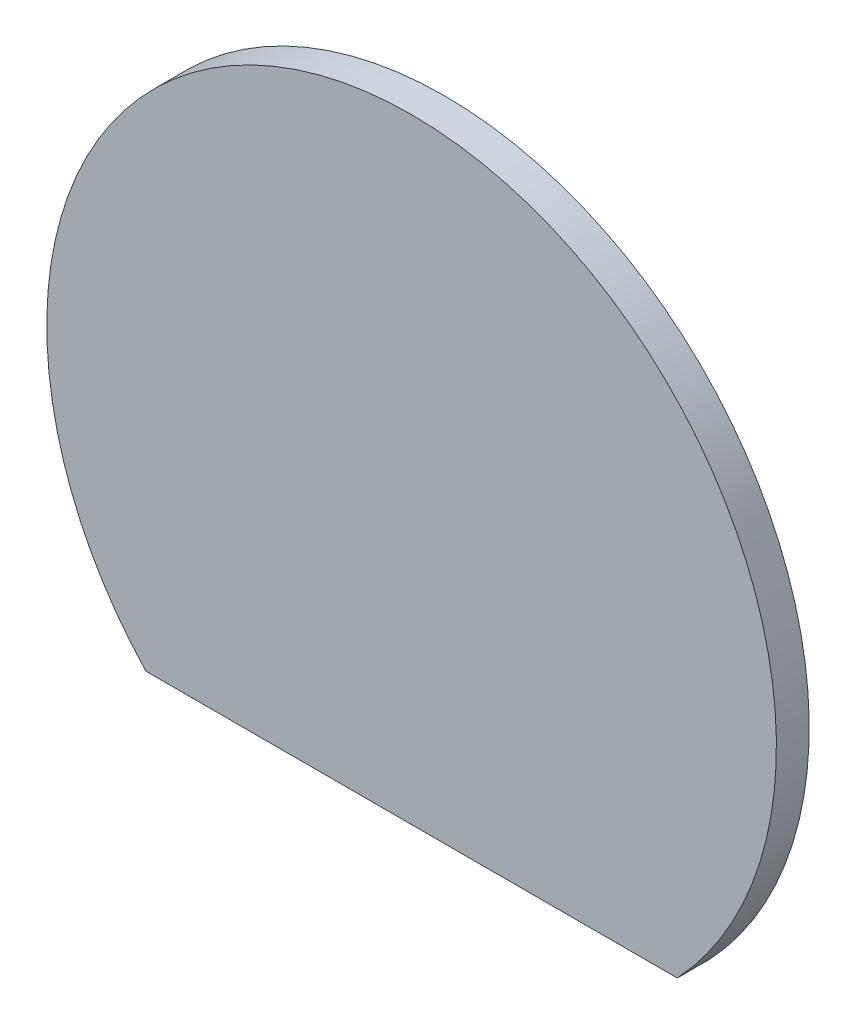
ISO-10303-21;
HEADER;
FILE_DESCRIPTION(('STEP AP214'),'2;1');
FILE_NAME('part.step','',(''),(''),'','','');
FILE_SCHEMA(('AUTOMOTIVE_DESIGN { 1 0 10303 214 1 1 1 1 }'));
ENDSEC;
DATA;
#1=APPLICATION_CONTEXT('core data for automotive mechanical design processes');
#2=APPLICATION_PROTOCOL_DEFINITION('international standard','automotive_design',2000,#1);
#3=PRODUCT_CONTEXT('',#1,'mechanical');
#4=PRODUCT('Part','Part','',(#3));
#5=PRODUCT_RELATED_PRODUCT_CATEGORY('part','',(#4));
#6=PRODUCT_DEFINITION_FORMATION('','',#4);
#7=PRODUCT_DEFINITION_CONTEXT('part definition',#1,'design');
#8=PRODUCT_DEFINITION('design','',#6,#7);
#9=PRODUCT_DEFINITION_SHAPE('','',#8);
#10=(LENGTH_UNIT() NAMED_UNIT(*) SI_UNIT(.MILLI.,.METRE.));
#11=(NAMED_UNIT(*) PLANE_ANGLE_UNIT() SI_UNIT($,.RADIAN.));
#12=(NAMED_UNIT(*) SI_UNIT($,.STERADIAN.) SOLID_ANGLE_UNIT());
#13=UNCERTAINTY_MEASURE_WITH_UNIT(LENGTH_MEASURE(1.E-05),#10,'distance_accuracy_value','');
#14=(GEOMETRIC_REPRESENTATION_CONTEXT(3) GLOBAL_UNCERTAINTY_ASSIGNED_CONTEXT((#13)) GLOBAL_UNIT_ASSIGNED_CONTEXT((#10,
#11,#12)) REPRESENTATION_CONTEXT('',''));
#15=CARTESIAN_POINT('',(0.,0.,0.));
#16=DIRECTION('',(0.,0.,1.));
#17=DIRECTION('',(1.,0.,0.));
#18=AXIS2_PLACEMENT_3D('',#15,#16,#17);
#19=CARTESIAN_POINT('',(0.,0.,1.6));
#20=DIRECTION('',(0.,0.,-1.));
#21=DIRECTION('',(-1.,0.,0.));
#22=AXIS2_PLACEMENT_3D('',#19,#20,#21);
#23=CYLINDRICAL_SURFACE('',#22,17.8);
#24=CARTESIAN_POINT('',(0.,0.,0.));
#25=DIRECTION('',(0.,0.,1.));
#26=DIRECTION('',(1.,0.,0.));
#27=AXIS2_PLACEMENT_3D('',#24,#25,#26);
#28=CIRCLE('',#27,17.8);
#29=CARTESIAN_POINT('',(12.9614813968157,-12.2,0.));
#30=VERTEX_POINT('',#29);
#31=CARTESIAN_POINT('',(-12.9614813968157,-12.2,0.));
#32=VERTEX_POINT('',#31);
#33=EDGE_CURVE('E74',#30,#32,#28,.T.);
#34=ORIENTED_EDGE('',*,*,#33,.T.);
#35=DIRECTION('',(0.,0.,-1.));
#36=VECTOR('',#35,1.);
#37=CARTESIAN_POINT('',(-12.9614813968157,-12.2,1.6));
#38=LINE('',#37,#36);
#39=CARTESIAN_POINT('',(-12.9614813968157,-12.2,1.6));
#40=VERTEX_POINT('',#39);
#41=EDGE_CURVE('E11',#40,#32,#38,.T.);
#42=ORIENTED_EDGE('',*,*,#41,.F.);
#43=CARTESIAN_POINT('',(0.,0.,1.6));
#44=DIRECTION('',(0.,0.,1.));
#45=DIRECTION('',(1.,0.,0.));
#46=AXIS2_PLACEMENT_3D('',#43,#44,#45);
#47=CIRCLE('',#46,17.8);
#48=CARTESIAN_POINT('',(12.9614813968157,-12.2,1.6));
#49=VERTEX_POINT('',#48);
#50=EDGE_CURVE('E73',#49,#40,#47,.T.);
#51=ORIENTED_EDGE('',*,*,#50,.F.);
#52=DIRECTION('',(0.,0.,-1.));
#53=VECTOR('',#52,1.);
#54=CARTESIAN_POINT('',(12.9614813968157,-12.2,1.6));
#55=LINE('',#54,#53);
#56=EDGE_CURVE('E51',#49,#30,#55,.T.);
#57=ORIENTED_EDGE('',*,*,#56,.T.);
#58=EDGE_LOOP('',(#34,#42,#51,#57));
#59=FACE_BOUND('',#58,.T.);
#60=ADVANCED_FACE('F43',(#59),#23,.T.);
#61=CARTESIAN_POINT('',(-12.9614813968157,-12.2,1.6));
#62=DIRECTION('',(0.,1.,0.));
#63=DIRECTION('',(0.,0.,1.));
#64=AXIS2_PLACEMENT_3D('',#61,#62,#63);
#65=PLANE('',#64);
#66=DIRECTION('',(1.,0.,0.));
#67=VECTOR('',#66,1.);
#68=CARTESIAN_POINT('',(-12.9614813968157,-12.2,0.));
#69=LINE('',#68,#67);
#70=EDGE_CURVE('E66',#32,#30,#69,.T.);
#71=ORIENTED_EDGE('',*,*,#70,.T.);
#72=ORIENTED_EDGE('',*,*,#56,.F.);
#73=DIRECTION('',(1.,0.,0.));
#74=VECTOR('',#73,1.);
#75=CARTESIAN_POINT('',(-12.9614813968157,-12.2,1.6));
#76=LINE('',#75,#74);
#77=EDGE_CURVE('E58',#40,#49,#76,.T.);
#78=ORIENTED_EDGE('',*,*,#77,.F.);
#79=ORIENTED_EDGE('',*,*,#41,.T.);
#80=EDGE_LOOP('',(#71,#72,#78,#79));
#81=FACE_BOUND('',#80,.T.);
#82=ADVANCED_FACE('F69',(#81),#65,.F.);
#83=CARTESIAN_POINT('',(0.,0.,1.6));
#84=DIRECTION('',(0.,0.,1.));
#85=DIRECTION('',(1.,0.,0.));
#86=AXIS2_PLACEMENT_3D('',#83,#84,#85);
#87=PLANE('',#86);
#88=ORIENTED_EDGE('',*,*,#50,.T.);
#89=ORIENTED_EDGE('',*,*,#77,.T.);
#90=EDGE_LOOP('',(#88,#89));
#91=FACE_BOUND('',#90,.T.);
#92=ADVANCED_FACE('F81',(#91),#87,.T.);
#93=CARTESIAN_POINT('',(0.,0.,0.));
#94=DIRECTION('',(0.,0.,1.));
#95=DIRECTION('',(1.,0.,0.));
#96=AXIS2_PLACEMENT_3D('',#93,#94,#95);
#97=PLANE('',#96);
#98=ORIENTED_EDGE('',*,*,#33,.F.);
#99=ORIENTED_EDGE('',*,*,#70,.F.);
#100=EDGE_LOOP('',(#98,#99));
#101=FACE_BOUND('',#100,.T.);
#102=ADVANCED_FACE('F77',(#101),#97,.F.);
#103=CLOSED_SHELL('',(#60,#82,#92,#102));
#104=MANIFOLD_SOLID_BREP('B2',#103);
#105=ADVANCED_BREP_SHAPE_REPRESENTATION('',(#18,#104),#14);
#106=SHAPE_DEFINITION_REPRESENTATION(#9,#105);
ENDSEC;
END-ISO-10303-21;
